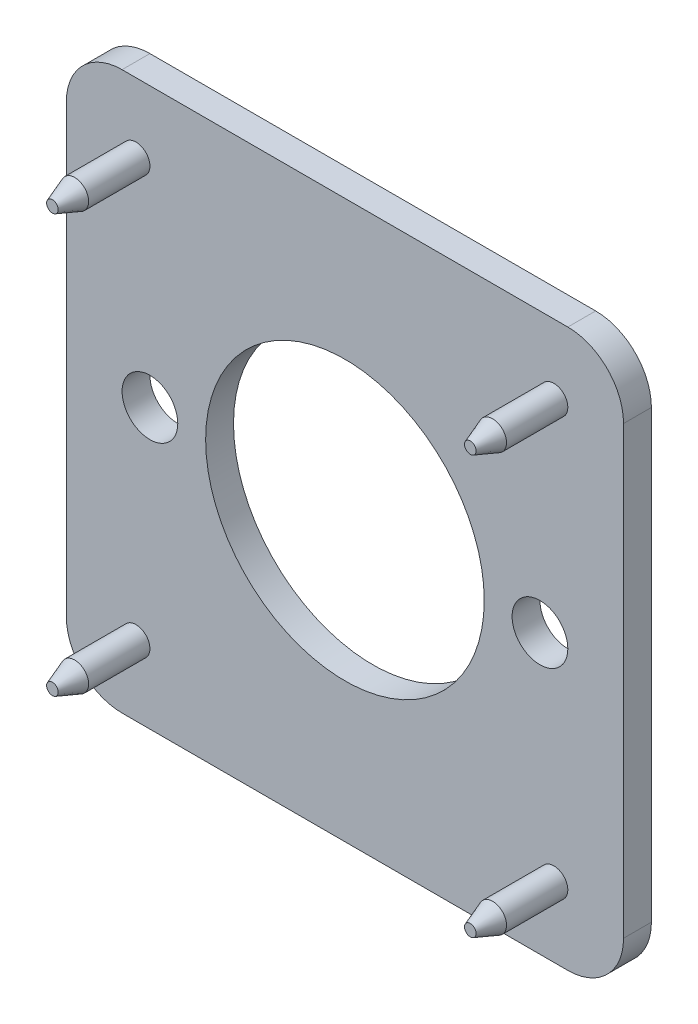
ISO-10303-21;
HEADER;
FILE_DESCRIPTION(('STEP AP214'),'2;1');
FILE_NAME('part.step','',(''),(''),'','','');
FILE_SCHEMA(('AUTOMOTIVE_DESIGN { 1 0 10303 214 1 1 1 1 }'));
ENDSEC;
DATA;
#1=APPLICATION_CONTEXT('core data for automotive mechanical design processes');
#2=APPLICATION_PROTOCOL_DEFINITION('international standard','automotive_design',2000,#1);
#3=PRODUCT_CONTEXT('',#1,'mechanical');
#4=PRODUCT('Part','Part','',(#3));
#5=PRODUCT_RELATED_PRODUCT_CATEGORY('part','',(#4));
#6=PRODUCT_DEFINITION_FORMATION('','',#4);
#7=PRODUCT_DEFINITION_CONTEXT('part definition',#1,'design');
#8=PRODUCT_DEFINITION('design','',#6,#7);
#9=PRODUCT_DEFINITION_SHAPE('','',#8);
#10=(LENGTH_UNIT() NAMED_UNIT(*) SI_UNIT(.MILLI.,.METRE.));
#11=(NAMED_UNIT(*) PLANE_ANGLE_UNIT() SI_UNIT($,.RADIAN.));
#12=(NAMED_UNIT(*) SI_UNIT($,.STERADIAN.) SOLID_ANGLE_UNIT());
#13=UNCERTAINTY_MEASURE_WITH_UNIT(LENGTH_MEASURE(1.E-05),#10,'distance_accuracy_value','');
#14=(GEOMETRIC_REPRESENTATION_CONTEXT(3) GLOBAL_UNCERTAINTY_ASSIGNED_CONTEXT((#13)) GLOBAL_UNIT_ASSIGNED_CONTEXT((#10,
#11,#12)) REPRESENTATION_CONTEXT('',''));
#15=CARTESIAN_POINT('',(0.,0.,0.));
#16=DIRECTION('',(0.,0.,1.));
#17=DIRECTION('',(1.,0.,0.));
#18=AXIS2_PLACEMENT_3D('',#15,#16,#17);
#19=CARTESIAN_POINT('',(-63.5,0.,6.35));
#20=DIRECTION('',(1.,0.,0.));
#21=DIRECTION('',(0.,0.,-1.));
#22=AXIS2_PLACEMENT_3D('',#19,#20,#21);
#23=PLANE('',#22);
#24=DIRECTION('',(0.,-1.,0.));
#25=VECTOR('',#24,1.);
#26=CARTESIAN_POINT('',(-63.5,0.,0.));
#27=LINE('',#26,#25);
#28=CARTESIAN_POINT('',(-63.5,50.8,0.));
#29=VERTEX_POINT('',#28);
#30=CARTESIAN_POINT('',(-63.5,-50.8,0.));
#31=VERTEX_POINT('',#30);
#32=EDGE_CURVE('E123',#29,#31,#27,.T.);
#33=ORIENTED_EDGE('',*,*,#32,.T.);
#34=DIRECTION('',(0.,0.,-1.));
#35=VECTOR('',#34,1.);
#36=CARTESIAN_POINT('',(-63.5,-50.8,6.35));
#37=LINE('',#36,#35);
#38=CARTESIAN_POINT('',(-63.5,-50.8,6.35));
#39=VERTEX_POINT('',#38);
#40=EDGE_CURVE('E152',#39,#31,#37,.T.);
#41=ORIENTED_EDGE('',*,*,#40,.F.);
#42=DIRECTION('',(0.,-1.,0.));
#43=VECTOR('',#42,1.);
#44=CARTESIAN_POINT('',(-63.5,0.,6.35));
#45=LINE('',#44,#43);
#46=CARTESIAN_POINT('',(-63.5,50.8,6.35));
#47=VERTEX_POINT('',#46);
#48=EDGE_CURVE('E303',#47,#39,#45,.T.);
#49=ORIENTED_EDGE('',*,*,#48,.F.);
#50=DIRECTION('',(0.,0.,-1.));
#51=VECTOR('',#50,1.);
#52=CARTESIAN_POINT('',(-63.5,50.8,6.35));
#53=LINE('',#52,#51);
#54=EDGE_CURVE('E110',#47,#29,#53,.T.);
#55=ORIENTED_EDGE('',*,*,#54,.T.);
#56=EDGE_LOOP('',(#33,#41,#49,#55));
#57=FACE_BOUND('',#56,.T.);
#58=ADVANCED_FACE('F17',(#57),#23,.F.);
#59=CARTESIAN_POINT('',(-50.8,-50.8,6.35));
#60=DIRECTION('',(0.,0.,-1.));
#61=DIRECTION('',(-1.,0.,0.));
#62=AXIS2_PLACEMENT_3D('',#59,#60,#61);
#63=CYLINDRICAL_SURFACE('',#62,12.7);
#64=CARTESIAN_POINT('',(-50.8,-50.8,0.));
#65=DIRECTION('',(0.,0.,1.));
#66=DIRECTION('',(1.,0.,0.));
#67=AXIS2_PLACEMENT_3D('',#64,#65,#66);
#68=CIRCLE('',#67,12.7);
#69=CARTESIAN_POINT('',(-50.8,-63.5,0.));
#70=VERTEX_POINT('',#69);
#71=EDGE_CURVE('E126',#31,#70,#68,.T.);
#72=ORIENTED_EDGE('',*,*,#71,.T.);
#73=DIRECTION('',(0.,0.,-1.));
#74=VECTOR('',#73,1.);
#75=CARTESIAN_POINT('',(-50.8,-63.5,6.35));
#76=LINE('',#75,#74);
#77=CARTESIAN_POINT('',(-50.8,-63.5,6.35));
#78=VERTEX_POINT('',#77);
#79=EDGE_CURVE('E149',#78,#70,#76,.T.);
#80=ORIENTED_EDGE('',*,*,#79,.F.);
#81=CARTESIAN_POINT('',(-50.8,-50.8,6.35));
#82=DIRECTION('',(0.,0.,1.));
#83=DIRECTION('',(1.,0.,0.));
#84=AXIS2_PLACEMENT_3D('',#81,#82,#83);
#85=CIRCLE('',#84,12.7);
#86=EDGE_CURVE('E75',#39,#78,#85,.T.);
#87=ORIENTED_EDGE('',*,*,#86,.F.);
#88=ORIENTED_EDGE('',*,*,#40,.T.);
#89=EDGE_LOOP('',(#72,#80,#87,#88));
#90=FACE_BOUND('',#89,.T.);
#91=ADVANCED_FACE('F190',(#90),#63,.T.);
#92=CARTESIAN_POINT('',(0.,-63.5,6.35));
#93=DIRECTION('',(0.,1.,0.));
#94=DIRECTION('',(0.,0.,1.));
#95=AXIS2_PLACEMENT_3D('',#92,#93,#94);
#96=PLANE('',#95);
#97=DIRECTION('',(1.,0.,0.));
#98=VECTOR('',#97,1.);
#99=CARTESIAN_POINT('',(0.,-63.5,0.));
#100=LINE('',#99,#98);
#101=CARTESIAN_POINT('',(50.8,-63.5,0.));
#102=VERTEX_POINT('',#101);
#103=EDGE_CURVE('E128',#70,#102,#100,.T.);
#104=ORIENTED_EDGE('',*,*,#103,.T.);
#105=DIRECTION('',(0.,0.,-1.));
#106=VECTOR('',#105,1.);
#107=CARTESIAN_POINT('',(50.8,-63.5,6.35));
#108=LINE('',#107,#106);
#109=CARTESIAN_POINT('',(50.8,-63.5,6.35));
#110=VERTEX_POINT('',#109);
#111=EDGE_CURVE('E146',#110,#102,#108,.T.);
#112=ORIENTED_EDGE('',*,*,#111,.F.);
#113=DIRECTION('',(1.,0.,0.));
#114=VECTOR('',#113,1.);
#115=CARTESIAN_POINT('',(0.,-63.5,6.35));
#116=LINE('',#115,#114);
#117=EDGE_CURVE('E298',#78,#110,#116,.T.);
#118=ORIENTED_EDGE('',*,*,#117,.F.);
#119=ORIENTED_EDGE('',*,*,#79,.T.);
#120=EDGE_LOOP('',(#104,#112,#118,#119));
#121=FACE_BOUND('',#120,.T.);
#122=ADVANCED_FACE('F197',(#121),#96,.F.);
#123=CARTESIAN_POINT('',(50.8,-50.8,6.35));
#124=DIRECTION('',(0.,0.,-1.));
#125=DIRECTION('',(-1.,0.,0.));
#126=AXIS2_PLACEMENT_3D('',#123,#124,#125);
#127=CYLINDRICAL_SURFACE('',#126,12.7);
#128=CARTESIAN_POINT('',(50.8,-50.8,0.));
#129=DIRECTION('',(0.,0.,1.));
#130=DIRECTION('',(1.,0.,0.));
#131=AXIS2_PLACEMENT_3D('',#128,#129,#130);
#132=CIRCLE('',#131,12.7);
#133=CARTESIAN_POINT('',(63.5,-50.8,0.));
#134=VERTEX_POINT('',#133);
#135=EDGE_CURVE('E130',#102,#134,#132,.T.);
#136=ORIENTED_EDGE('',*,*,#135,.T.);
#137=DIRECTION('',(0.,0.,-1.));
#138=VECTOR('',#137,1.);
#139=CARTESIAN_POINT('',(63.5,-50.8,6.35));
#140=LINE('',#139,#138);
#141=CARTESIAN_POINT('',(63.5,-50.8,6.35));
#142=VERTEX_POINT('',#141);
#143=EDGE_CURVE('E144',#142,#134,#140,.T.);
#144=ORIENTED_EDGE('',*,*,#143,.F.);
#145=CARTESIAN_POINT('',(50.8,-50.8,6.35));
#146=DIRECTION('',(0.,0.,1.));
#147=DIRECTION('',(1.,0.,0.));
#148=AXIS2_PLACEMENT_3D('',#145,#146,#147);
#149=CIRCLE('',#148,12.7);
#150=EDGE_CURVE('E295',#110,#142,#149,.T.);
#151=ORIENTED_EDGE('',*,*,#150,.F.);
#152=ORIENTED_EDGE('',*,*,#111,.T.);
#153=EDGE_LOOP('',(#136,#144,#151,#152));
#154=FACE_BOUND('',#153,.T.);
#155=ADVANCED_FACE('F279',(#154),#127,.T.);
#156=CARTESIAN_POINT('',(63.5,0.,6.35));
#157=DIRECTION('',(1.,0.,0.));
#158=DIRECTION('',(0.,0.,-1.));
#159=AXIS2_PLACEMENT_3D('',#156,#157,#158);
#160=PLANE('',#159);
#161=DIRECTION('',(0.,-1.,0.));
#162=VECTOR('',#161,1.);
#163=CARTESIAN_POINT('',(63.5,0.,0.));
#164=LINE('',#163,#162);
#165=CARTESIAN_POINT('',(63.5,50.8,0.));
#166=VERTEX_POINT('',#165);
#167=EDGE_CURVE('E133',#166,#134,#164,.T.);
#168=ORIENTED_EDGE('',*,*,#167,.F.);
#169=DIRECTION('',(0.,0.,-1.));
#170=VECTOR('',#169,1.);
#171=CARTESIAN_POINT('',(63.5,50.8,6.35));
#172=LINE('',#171,#170);
#173=CARTESIAN_POINT('',(63.5,50.8,6.35));
#174=VERTEX_POINT('',#173);
#175=EDGE_CURVE('E106',#174,#166,#172,.T.);
#176=ORIENTED_EDGE('',*,*,#175,.F.);
#177=DIRECTION('',(0.,-1.,0.));
#178=VECTOR('',#177,1.);
#179=CARTESIAN_POINT('',(63.5,0.,6.35));
#180=LINE('',#179,#178);
#181=EDGE_CURVE('E95',#174,#142,#180,.T.);
#182=ORIENTED_EDGE('',*,*,#181,.T.);
#183=ORIENTED_EDGE('',*,*,#143,.T.);
#184=EDGE_LOOP('',(#168,#176,#182,#183));
#185=FACE_BOUND('',#184,.T.);
#186=ADVANCED_FACE('F276',(#185),#160,.T.);
#187=CARTESIAN_POINT('',(50.8,50.8,6.35));
#188=DIRECTION('',(0.,0.,-1.));
#189=DIRECTION('',(-1.,0.,0.));
#190=AXIS2_PLACEMENT_3D('',#187,#188,#189);
#191=CYLINDRICAL_SURFACE('',#190,12.7);
#192=CARTESIAN_POINT('',(50.8,50.8,0.));
#193=DIRECTION('',(0.,0.,1.));
#194=DIRECTION('',(1.,0.,0.));
#195=AXIS2_PLACEMENT_3D('',#192,#193,#194);
#196=CIRCLE('',#195,12.7);
#197=CARTESIAN_POINT('',(50.8,63.5,0.));
#198=VERTEX_POINT('',#197);
#199=EDGE_CURVE('E102',#166,#198,#196,.T.);
#200=ORIENTED_EDGE('',*,*,#199,.T.);
#201=DIRECTION('',(0.,0.,-1.));
#202=VECTOR('',#201,1.);
#203=CARTESIAN_POINT('',(50.8,63.5,6.35));
#204=LINE('',#203,#202);
#205=CARTESIAN_POINT('',(50.8,63.5,6.35));
#206=VERTEX_POINT('',#205);
#207=EDGE_CURVE('E99',#206,#198,#204,.T.);
#208=ORIENTED_EDGE('',*,*,#207,.F.);
#209=CARTESIAN_POINT('',(50.8,50.8,6.35));
#210=DIRECTION('',(0.,0.,1.));
#211=DIRECTION('',(1.,0.,0.));
#212=AXIS2_PLACEMENT_3D('',#209,#210,#211);
#213=CIRCLE('',#212,12.7);
#214=EDGE_CURVE('E89',#174,#206,#213,.T.);
#215=ORIENTED_EDGE('',*,*,#214,.F.);
#216=ORIENTED_EDGE('',*,*,#175,.T.);
#217=EDGE_LOOP('',(#200,#208,#215,#216));
#218=FACE_BOUND('',#217,.T.);
#219=ADVANCED_FACE('F100',(#218),#191,.T.);
#220=CARTESIAN_POINT('',(0.,63.5,6.35));
#221=DIRECTION('',(0.,1.,0.));
#222=DIRECTION('',(0.,0.,1.));
#223=AXIS2_PLACEMENT_3D('',#220,#221,#222);
#224=PLANE('',#223);
#225=DIRECTION('',(1.,0.,0.));
#226=VECTOR('',#225,1.);
#227=CARTESIAN_POINT('',(0.,63.5,0.));
#228=LINE('',#227,#226);
#229=CARTESIAN_POINT('',(-50.8,63.5,0.));
#230=VERTEX_POINT('',#229);
#231=EDGE_CURVE('E137',#230,#198,#228,.T.);
#232=ORIENTED_EDGE('',*,*,#231,.F.);
#233=DIRECTION('',(0.,0.,-1.));
#234=VECTOR('',#233,1.);
#235=CARTESIAN_POINT('',(-50.8,63.5,6.35));
#236=LINE('',#235,#234);
#237=CARTESIAN_POINT('',(-50.8,63.5,6.35));
#238=VERTEX_POINT('',#237);
#239=EDGE_CURVE('E63',#238,#230,#236,.T.);
#240=ORIENTED_EDGE('',*,*,#239,.F.);
#241=DIRECTION('',(1.,0.,0.));
#242=VECTOR('',#241,1.);
#243=CARTESIAN_POINT('',(0.,63.5,6.35));
#244=LINE('',#243,#242);
#245=EDGE_CURVE('E93',#238,#206,#244,.T.);
#246=ORIENTED_EDGE('',*,*,#245,.T.);
#247=ORIENTED_EDGE('',*,*,#207,.T.);
#248=EDGE_LOOP('',(#232,#240,#246,#247));
#249=FACE_BOUND('',#248,.T.);
#250=ADVANCED_FACE('F108',(#249),#224,.T.);
#251=CARTESIAN_POINT('',(0.,0.,6.35));
#252=DIRECTION('',(0.,0.,-1.));
#253=DIRECTION('',(-1.,0.,0.));
#254=AXIS2_PLACEMENT_3D('',#251,#252,#253);
#255=CYLINDRICAL_SURFACE('',#254,31.75);
#256=CARTESIAN_POINT('',(0.,0.,6.35));
#257=DIRECTION('',(0.,0.,1.));
#258=DIRECTION('',(1.,0.,0.));
#259=AXIS2_PLACEMENT_3D('',#256,#257,#258);
#260=CIRCLE('',#259,31.75);
#261=CARTESIAN_POINT('',(31.75,0.,6.35));
#262=VERTEX_POINT('',#261);
#263=EDGE_CURVE('E305',#262,#262,#260,.T.);
#264=ORIENTED_EDGE('',*,*,#263,.T.);
#265=EDGE_LOOP('',(#264));
#266=FACE_BOUND('',#265,.T.);
#267=CARTESIAN_POINT('',(0.,0.,0.));
#268=DIRECTION('',(0.,0.,1.));
#269=DIRECTION('',(1.,0.,0.));
#270=AXIS2_PLACEMENT_3D('',#267,#268,#269);
#271=CIRCLE('',#270,31.75);
#272=CARTESIAN_POINT('',(31.75,0.,0.));
#273=VERTEX_POINT('',#272);
#274=EDGE_CURVE('E120',#273,#273,#271,.T.);
#275=ORIENTED_EDGE('',*,*,#274,.F.);
#276=EDGE_LOOP('',(#275));
#277=FACE_BOUND('',#276,.T.);
#278=ADVANCED_FACE('F201',(#266,#277),#255,.F.);
#279=CARTESIAN_POINT('',(-44.45,0.,6.35));
#280=DIRECTION('',(0.,0.,-1.));
#281=DIRECTION('',(-1.,0.,0.));
#282=AXIS2_PLACEMENT_3D('',#279,#280,#281);
#283=CYLINDRICAL_SURFACE('',#282,6.35);
#284=CARTESIAN_POINT('',(-44.45,0.,6.35));
#285=DIRECTION('',(0.,0.,1.));
#286=DIRECTION('',(1.,0.,0.));
#287=AXIS2_PLACEMENT_3D('',#284,#285,#286);
#288=CIRCLE('',#287,6.35);
#289=CARTESIAN_POINT('',(-38.1,0.,6.35));
#290=VERTEX_POINT('',#289);
#291=EDGE_CURVE('E308',#290,#290,#288,.T.);
#292=ORIENTED_EDGE('',*,*,#291,.T.);
#293=EDGE_LOOP('',(#292));
#294=FACE_BOUND('',#293,.T.);
#295=CARTESIAN_POINT('',(-44.45,0.,0.));
#296=DIRECTION('',(0.,0.,1.));
#297=DIRECTION('',(1.,0.,0.));
#298=AXIS2_PLACEMENT_3D('',#295,#296,#297);
#299=CIRCLE('',#298,6.35);
#300=CARTESIAN_POINT('',(-38.1,0.,0.));
#301=VERTEX_POINT('',#300);
#302=EDGE_CURVE('E117',#301,#301,#299,.T.);
#303=ORIENTED_EDGE('',*,*,#302,.F.);
#304=EDGE_LOOP('',(#303));
#305=FACE_BOUND('',#304,.T.);
#306=ADVANCED_FACE('F204',(#294,#305),#283,.F.);
#307=CARTESIAN_POINT('',(44.45,0.,6.35));
#308=DIRECTION('',(0.,0.,-1.));
#309=DIRECTION('',(-1.,0.,0.));
#310=AXIS2_PLACEMENT_3D('',#307,#308,#309);
#311=CYLINDRICAL_SURFACE('',#310,6.35);
#312=CARTESIAN_POINT('',(44.45,0.,6.35));
#313=DIRECTION('',(0.,0.,-1.));
#314=DIRECTION('',(1.,0.,0.));
#315=AXIS2_PLACEMENT_3D('',#312,#313,#314);
#316=CIRCLE('',#315,6.35);
#317=CARTESIAN_POINT('',(50.8,0.,6.35));
#318=VERTEX_POINT('',#317);
#319=EDGE_CURVE('E140',#318,#318,#316,.T.);
#320=ORIENTED_EDGE('',*,*,#319,.F.);
#321=EDGE_LOOP('',(#320));
#322=FACE_BOUND('',#321,.T.);
#323=CARTESIAN_POINT('',(44.45,0.,0.));
#324=DIRECTION('',(0.,0.,-1.));
#325=DIRECTION('',(1.,0.,0.));
#326=AXIS2_PLACEMENT_3D('',#323,#324,#325);
#327=CIRCLE('',#326,6.35);
#328=CARTESIAN_POINT('',(50.8,0.,0.));
#329=VERTEX_POINT('',#328);
#330=EDGE_CURVE('E114',#329,#329,#327,.T.);
#331=ORIENTED_EDGE('',*,*,#330,.T.);
#332=EDGE_LOOP('',(#331));
#333=FACE_BOUND('',#332,.T.);
#334=ADVANCED_FACE('F208',(#322,#333),#311,.F.);
#335=CARTESIAN_POINT('',(-50.8,50.8,6.35));
#336=DIRECTION('',(0.,0.,-1.));
#337=DIRECTION('',(-1.,0.,0.));
#338=AXIS2_PLACEMENT_3D('',#335,#336,#337);
#339=CYLINDRICAL_SURFACE('',#338,12.7);
#340=CARTESIAN_POINT('',(-50.8,50.8,0.));
#341=DIRECTION('',(0.,0.,1.));
#342=DIRECTION('',(1.,0.,0.));
#343=AXIS2_PLACEMENT_3D('',#340,#341,#342);
#344=CIRCLE('',#343,12.7);
#345=EDGE_CURVE('E66',#230,#29,#344,.T.);
#346=ORIENTED_EDGE('',*,*,#345,.T.);
#347=ORIENTED_EDGE('',*,*,#54,.F.);
#348=CARTESIAN_POINT('',(-50.8,50.8,6.35));
#349=DIRECTION('',(0.,0.,1.));
#350=DIRECTION('',(1.,0.,0.));
#351=AXIS2_PLACEMENT_3D('',#348,#349,#350);
#352=CIRCLE('',#351,12.7);
#353=EDGE_CURVE('E35',#238,#47,#352,.T.);
#354=ORIENTED_EDGE('',*,*,#353,.F.);
#355=ORIENTED_EDGE('',*,*,#239,.T.);
#356=EDGE_LOOP('',(#346,#347,#354,#355));
#357=FACE_BOUND('',#356,.T.);
#358=ADVANCED_FACE('F212',(#357),#339,.T.);
#359=CARTESIAN_POINT('',(0.,0.,6.35));
#360=DIRECTION('',(0.,0.,1.));
#361=DIRECTION('',(1.,0.,0.));
#362=AXIS2_PLACEMENT_3D('',#359,#360,#361);
#363=PLANE('',#362);
#364=CARTESIAN_POINT('',(47.625,47.625,6.35));
#365=DIRECTION('',(0.,0.,1.));
#366=DIRECTION('',(1.,0.,0.));
#367=AXIS2_PLACEMENT_3D('',#364,#365,#366);
#368=CIRCLE('',#367,3.175);
#369=CARTESIAN_POINT('',(50.8,47.625,6.35));
#370=VERTEX_POINT('',#369);
#371=EDGE_CURVE('E159',#370,#370,#368,.T.);
#372=ORIENTED_EDGE('',*,*,#371,.F.);
#373=EDGE_LOOP('',(#372));
#374=FACE_BOUND('',#373,.T.);
#375=CARTESIAN_POINT('',(47.625,-47.625,6.35));
#376=DIRECTION('',(0.,0.,1.));
#377=DIRECTION('',(1.,0.,0.));
#378=AXIS2_PLACEMENT_3D('',#375,#376,#377);
#379=CIRCLE('',#378,3.175);
#380=CARTESIAN_POINT('',(50.8,-47.625,6.35));
#381=VERTEX_POINT('',#380);
#382=EDGE_CURVE('E318',#381,#381,#379,.T.);
#383=ORIENTED_EDGE('',*,*,#382,.F.);
#384=EDGE_LOOP('',(#383));
#385=FACE_BOUND('',#384,.T.);
#386=CARTESIAN_POINT('',(-47.625,-47.625,6.35));
#387=DIRECTION('',(0.,0.,1.));
#388=DIRECTION('',(1.,0.,0.));
#389=AXIS2_PLACEMENT_3D('',#386,#387,#388);
#390=CIRCLE('',#389,3.175);
#391=CARTESIAN_POINT('',(-44.45,-47.625,6.35));
#392=VERTEX_POINT('',#391);
#393=EDGE_CURVE('E315',#392,#392,#390,.T.);
#394=ORIENTED_EDGE('',*,*,#393,.F.);
#395=EDGE_LOOP('',(#394));
#396=FACE_BOUND('',#395,.T.);
#397=CARTESIAN_POINT('',(-47.625,47.625,6.35));
#398=DIRECTION('',(0.,0.,1.));
#399=DIRECTION('',(1.,0.,0.));
#400=AXIS2_PLACEMENT_3D('',#397,#398,#399);
#401=CIRCLE('',#400,3.175);
#402=CARTESIAN_POINT('',(-44.45,47.625,6.35));
#403=VERTEX_POINT('',#402);
#404=EDGE_CURVE('E154',#403,#403,#401,.T.);
#405=ORIENTED_EDGE('',*,*,#404,.F.);
#406=EDGE_LOOP('',(#405));
#407=FACE_BOUND('',#406,.T.);
#408=ORIENTED_EDGE('',*,*,#319,.T.);
#409=EDGE_LOOP('',(#408));
#410=FACE_BOUND('',#409,.T.);
#411=ORIENTED_EDGE('',*,*,#291,.F.);
#412=EDGE_LOOP('',(#411));
#413=FACE_BOUND('',#412,.T.);
#414=ORIENTED_EDGE('',*,*,#263,.F.);
#415=EDGE_LOOP('',(#414));
#416=FACE_BOUND('',#415,.T.);
#417=ORIENTED_EDGE('',*,*,#48,.T.);
#418=ORIENTED_EDGE('',*,*,#86,.T.);
#419=ORIENTED_EDGE('',*,*,#117,.T.);
#420=ORIENTED_EDGE('',*,*,#150,.T.);
#421=ORIENTED_EDGE('',*,*,#181,.F.);
#422=ORIENTED_EDGE('',*,*,#214,.T.);
#423=ORIENTED_EDGE('',*,*,#245,.F.);
#424=ORIENTED_EDGE('',*,*,#353,.T.);
#425=EDGE_LOOP('',(#417,#418,#419,#420,#421,#422,#423,#424));
#426=FACE_BOUND('',#425,.T.);
#427=ADVANCED_FACE('F91',(#374,#385,#396,#407,#410,#413,#416,#426),#363,.T.);
#428=CARTESIAN_POINT('',(0.,0.,0.));
#429=DIRECTION('',(0.,0.,1.));
#430=DIRECTION('',(1.,0.,0.));
#431=AXIS2_PLACEMENT_3D('',#428,#429,#430);
#432=PLANE('',#431);
#433=ORIENTED_EDGE('',*,*,#330,.F.);
#434=EDGE_LOOP('',(#433));
#435=FACE_BOUND('',#434,.T.);
#436=ORIENTED_EDGE('',*,*,#302,.T.);
#437=EDGE_LOOP('',(#436));
#438=FACE_BOUND('',#437,.T.);
#439=ORIENTED_EDGE('',*,*,#274,.T.);
#440=EDGE_LOOP('',(#439));
#441=FACE_BOUND('',#440,.T.);
#442=ORIENTED_EDGE('',*,*,#32,.F.);
#443=ORIENTED_EDGE('',*,*,#345,.F.);
#444=ORIENTED_EDGE('',*,*,#231,.T.);
#445=ORIENTED_EDGE('',*,*,#199,.F.);
#446=ORIENTED_EDGE('',*,*,#167,.T.);
#447=ORIENTED_EDGE('',*,*,#135,.F.);
#448=ORIENTED_EDGE('',*,*,#103,.F.);
#449=ORIENTED_EDGE('',*,*,#71,.F.);
#450=EDGE_LOOP('',(#442,#443,#444,#445,#446,#447,#448,#449));
#451=FACE_BOUND('',#450,.T.);
#452=ADVANCED_FACE('F262',(#435,#438,#441,#451),#432,.F.);
#453=CARTESIAN_POINT('',(-47.625,47.625,25.4));
#454=DIRECTION('',(0.,0.,-1.));
#455=DIRECTION('',(-1.,0.,0.));
#456=AXIS2_PLACEMENT_3D('',#453,#454,#455);
#457=CYLINDRICAL_SURFACE('',#456,3.175);
#458=CARTESIAN_POINT('',(-47.625,47.625,20.32));
#459=DIRECTION('',(0.,0.,1.));
#460=DIRECTION('',(1.,0.,0.));
#461=AXIS2_PLACEMENT_3D('',#458,#459,#460);
#462=CIRCLE('',#461,3.175);
#463=CARTESIAN_POINT('',(-44.45,47.625,20.32));
#464=VERTEX_POINT('',#463);
#465=EDGE_CURVE('E11',#464,#464,#462,.F.);
#466=ORIENTED_EDGE('',*,*,#465,.T.);
#467=EDGE_LOOP('',(#466));
#468=FACE_BOUND('',#467,.T.);
#469=ORIENTED_EDGE('',*,*,#404,.T.);
#470=EDGE_LOOP('',(#469));
#471=FACE_BOUND('',#470,.T.);
#472=ADVANCED_FACE('F259',(#468,#471),#457,.T.);
#473=CARTESIAN_POINT('',(0.,0.,25.4));
#474=DIRECTION('',(0.,0.,1.));
#475=DIRECTION('',(1.,0.,0.));
#476=AXIS2_PLACEMENT_3D('',#473,#474,#475);
#477=PLANE('',#476);
#478=CARTESIAN_POINT('',(-47.625,47.625,25.4));
#479=DIRECTION('',(0.,0.,1.));
#480=DIRECTION('',(1.,0.,0.));
#481=AXIS2_PLACEMENT_3D('',#478,#479,#480);
#482=CIRCLE('',#481,1.32603120992769);
#483=CARTESIAN_POINT('',(-46.2989687900723,47.625,25.4));
#484=VERTEX_POINT('',#483);
#485=EDGE_CURVE('E27',#484,#484,#482,.T.);
#486=ORIENTED_EDGE('',*,*,#485,.T.);
#487=EDGE_LOOP('',(#486));
#488=FACE_BOUND('',#487,.T.);
#489=ADVANCED_FACE('F176',(#488),#477,.T.);
#490=CARTESIAN_POINT('',(-47.625,-47.625,25.4));
#491=DIRECTION('',(0.,0.,-1.));
#492=DIRECTION('',(-1.,0.,0.));
#493=AXIS2_PLACEMENT_3D('',#490,#491,#492);
#494=CYLINDRICAL_SURFACE('',#493,3.175);
#495=CARTESIAN_POINT('',(-47.625,-47.625,20.32));
#496=DIRECTION('',(0.,0.,1.));
#497=DIRECTION('',(1.,0.,0.));
#498=AXIS2_PLACEMENT_3D('',#495,#496,#497);
#499=CIRCLE('',#498,3.175);
#500=CARTESIAN_POINT('',(-44.45,-47.625,20.32));
#501=VERTEX_POINT('',#500);
#502=EDGE_CURVE('E171',#501,#501,#499,.F.);
#503=ORIENTED_EDGE('',*,*,#502,.T.);
#504=EDGE_LOOP('',(#503));
#505=FACE_BOUND('',#504,.T.);
#506=ORIENTED_EDGE('',*,*,#393,.T.);
#507=EDGE_LOOP('',(#506));
#508=FACE_BOUND('',#507,.T.);
#509=ADVANCED_FACE('F258',(#505,#508),#494,.T.);
#510=CARTESIAN_POINT('',(0.,0.,25.4));
#511=DIRECTION('',(0.,0.,1.));
#512=DIRECTION('',(1.,0.,0.));
#513=AXIS2_PLACEMENT_3D('',#510,#511,#512);
#514=PLANE('',#513);
#515=CARTESIAN_POINT('',(-47.625,-47.625,25.4));
#516=DIRECTION('',(0.,0.,1.));
#517=DIRECTION('',(1.,0.,0.));
#518=AXIS2_PLACEMENT_3D('',#515,#516,#517);
#519=CIRCLE('',#518,1.32603120992769);
#520=CARTESIAN_POINT('',(-46.2989687900723,-47.625,25.4));
#521=VERTEX_POINT('',#520);
#522=EDGE_CURVE('E168',#521,#521,#519,.T.);
#523=ORIENTED_EDGE('',*,*,#522,.T.);
#524=EDGE_LOOP('',(#523));
#525=FACE_BOUND('',#524,.T.);
#526=ADVANCED_FACE('F343',(#525),#514,.T.);
#527=CARTESIAN_POINT('',(47.625,-47.625,25.4));
#528=DIRECTION('',(0.,0.,-1.));
#529=DIRECTION('',(-1.,0.,0.));
#530=AXIS2_PLACEMENT_3D('',#527,#528,#529);
#531=CYLINDRICAL_SURFACE('',#530,3.175);
#532=CARTESIAN_POINT('',(47.625,-47.625,20.32));
#533=DIRECTION('',(0.,0.,1.));
#534=DIRECTION('',(1.,0.,0.));
#535=AXIS2_PLACEMENT_3D('',#532,#533,#534);
#536=CIRCLE('',#535,3.175);
#537=CARTESIAN_POINT('',(50.8,-47.625,20.32));
#538=VERTEX_POINT('',#537);
#539=EDGE_CURVE('E158',#538,#538,#536,.F.);
#540=ORIENTED_EDGE('',*,*,#539,.T.);
#541=EDGE_LOOP('',(#540));
#542=FACE_BOUND('',#541,.T.);
#543=ORIENTED_EDGE('',*,*,#382,.T.);
#544=EDGE_LOOP('',(#543));
#545=FACE_BOUND('',#544,.T.);
#546=ADVANCED_FACE('F253',(#542,#545),#531,.T.);
#547=CARTESIAN_POINT('',(0.,0.,25.4));
#548=DIRECTION('',(0.,0.,1.));
#549=DIRECTION('',(1.,0.,0.));
#550=AXIS2_PLACEMENT_3D('',#547,#548,#549);
#551=PLANE('',#550);
#552=CARTESIAN_POINT('',(47.625,-47.625,25.4));
#553=DIRECTION('',(0.,0.,1.));
#554=DIRECTION('',(1.,0.,0.));
#555=AXIS2_PLACEMENT_3D('',#552,#553,#554);
#556=CIRCLE('',#555,1.32603120992769);
#557=CARTESIAN_POINT('',(48.9510312099277,-47.625,25.4));
#558=VERTEX_POINT('',#557);
#559=EDGE_CURVE('E155',#558,#558,#556,.T.);
#560=ORIENTED_EDGE('',*,*,#559,.T.);
#561=EDGE_LOOP('',(#560));
#562=FACE_BOUND('',#561,.T.);
#563=ADVANCED_FACE('F249',(#562),#551,.T.);
#564=CARTESIAN_POINT('',(47.625,47.625,25.4));
#565=DIRECTION('',(0.,0.,-1.));
#566=DIRECTION('',(-1.,0.,0.));
#567=AXIS2_PLACEMENT_3D('',#564,#565,#566);
#568=CYLINDRICAL_SURFACE('',#567,3.175);
#569=CARTESIAN_POINT('',(47.625,47.625,20.32));
#570=DIRECTION('',(0.,0.,1.));
#571=DIRECTION('',(1.,0.,0.));
#572=AXIS2_PLACEMENT_3D('',#569,#570,#571);
#573=CIRCLE('',#572,3.175);
#574=CARTESIAN_POINT('',(50.8,47.625,20.32));
#575=VERTEX_POINT('',#574);
#576=EDGE_CURVE('E165',#575,#575,#573,.F.);
#577=ORIENTED_EDGE('',*,*,#576,.T.);
#578=EDGE_LOOP('',(#577));
#579=FACE_BOUND('',#578,.T.);
#580=ORIENTED_EDGE('',*,*,#371,.T.);
#581=EDGE_LOOP('',(#580));
#582=FACE_BOUND('',#581,.T.);
#583=ADVANCED_FACE('F243',(#579,#582),#568,.T.);
#584=CARTESIAN_POINT('',(0.,0.,25.4));
#585=DIRECTION('',(0.,0.,1.));
#586=DIRECTION('',(1.,0.,0.));
#587=AXIS2_PLACEMENT_3D('',#584,#585,#586);
#588=PLANE('',#587);
#589=CARTESIAN_POINT('',(47.625,47.625,25.4));
#590=DIRECTION('',(0.,0.,1.));
#591=DIRECTION('',(1.,0.,0.));
#592=AXIS2_PLACEMENT_3D('',#589,#590,#591);
#593=CIRCLE('',#592,1.32603120992769);
#594=CARTESIAN_POINT('',(48.9510312099277,47.625,25.4));
#595=VERTEX_POINT('',#594);
#596=EDGE_CURVE('E162',#595,#595,#593,.T.);
#597=ORIENTED_EDGE('',*,*,#596,.T.);
#598=EDGE_LOOP('',(#597));
#599=FACE_BOUND('',#598,.T.);
#600=ADVANCED_FACE('F222',(#599),#588,.T.);
#601=CARTESIAN_POINT('',(47.625,-47.625,25.4));
#602=DIRECTION('',(0.,0.,-1.));
#603=DIRECTION('',(-1.,0.,0.));
#604=AXIS2_PLACEMENT_3D('',#601,#602,#603);
#605=CONICAL_SURFACE('',#604,1.32603120992769,0.349065850398864);
#606=ORIENTED_EDGE('',*,*,#539,.F.);
#607=EDGE_LOOP('',(#606));
#608=FACE_BOUND('',#607,.T.);
#609=ORIENTED_EDGE('',*,*,#559,.F.);
#610=EDGE_LOOP('',(#609));
#611=FACE_BOUND('',#610,.T.);
#612=ADVANCED_FACE('F215',(#608,#611),#605,.T.);
#613=CARTESIAN_POINT('',(47.625,47.625,25.4));
#614=DIRECTION('',(0.,0.,-1.));
#615=DIRECTION('',(-1.,0.,0.));
#616=AXIS2_PLACEMENT_3D('',#613,#614,#615);
#617=CONICAL_SURFACE('',#616,1.32603120992769,0.349065850398864);
#618=ORIENTED_EDGE('',*,*,#576,.F.);
#619=EDGE_LOOP('',(#618));
#620=FACE_BOUND('',#619,.T.);
#621=ORIENTED_EDGE('',*,*,#596,.F.);
#622=EDGE_LOOP('',(#621));
#623=FACE_BOUND('',#622,.T.);
#624=ADVANCED_FACE('F186',(#620,#623),#617,.T.);
#625=CARTESIAN_POINT('',(-47.625,-47.625,25.4));
#626=DIRECTION('',(0.,0.,-1.));
#627=DIRECTION('',(-1.,0.,0.));
#628=AXIS2_PLACEMENT_3D('',#625,#626,#627);
#629=CONICAL_SURFACE('',#628,1.32603120992769,0.349065850398864);
#630=ORIENTED_EDGE('',*,*,#502,.F.);
#631=EDGE_LOOP('',(#630));
#632=FACE_BOUND('',#631,.T.);
#633=ORIENTED_EDGE('',*,*,#522,.F.);
#634=EDGE_LOOP('',(#633));
#635=FACE_BOUND('',#634,.T.);
#636=ADVANCED_FACE('F179',(#632,#635),#629,.T.);
#637=CARTESIAN_POINT('',(-47.625,47.625,25.4));
#638=DIRECTION('',(0.,0.,-1.));
#639=DIRECTION('',(-1.,0.,0.));
#640=AXIS2_PLACEMENT_3D('',#637,#638,#639);
#641=CONICAL_SURFACE('',#640,1.32603120992769,0.349065850398864);
#642=ORIENTED_EDGE('',*,*,#465,.F.);
#643=EDGE_LOOP('',(#642));
#644=FACE_BOUND('',#643,.T.);
#645=ORIENTED_EDGE('',*,*,#485,.F.);
#646=EDGE_LOOP('',(#645));
#647=FACE_BOUND('',#646,.T.);
#648=ADVANCED_FACE('F20',(#644,#647),#641,.T.);
#649=CLOSED_SHELL('',(#58,#91,#122,#155,#186,#219,#250,#278,#306,#334,#358,#427,#452,#472,#489,
#509,#526,#546,#563,#583,#600,#612,#624,#636,#648));
#650=MANIFOLD_SOLID_BREP('B1',#649);
#651=ADVANCED_BREP_SHAPE_REPRESENTATION('',(#18,#650),#14);
#652=SHAPE_DEFINITION_REPRESENTATION(#9,#651);
ENDSEC;
END-ISO-10303-21;
